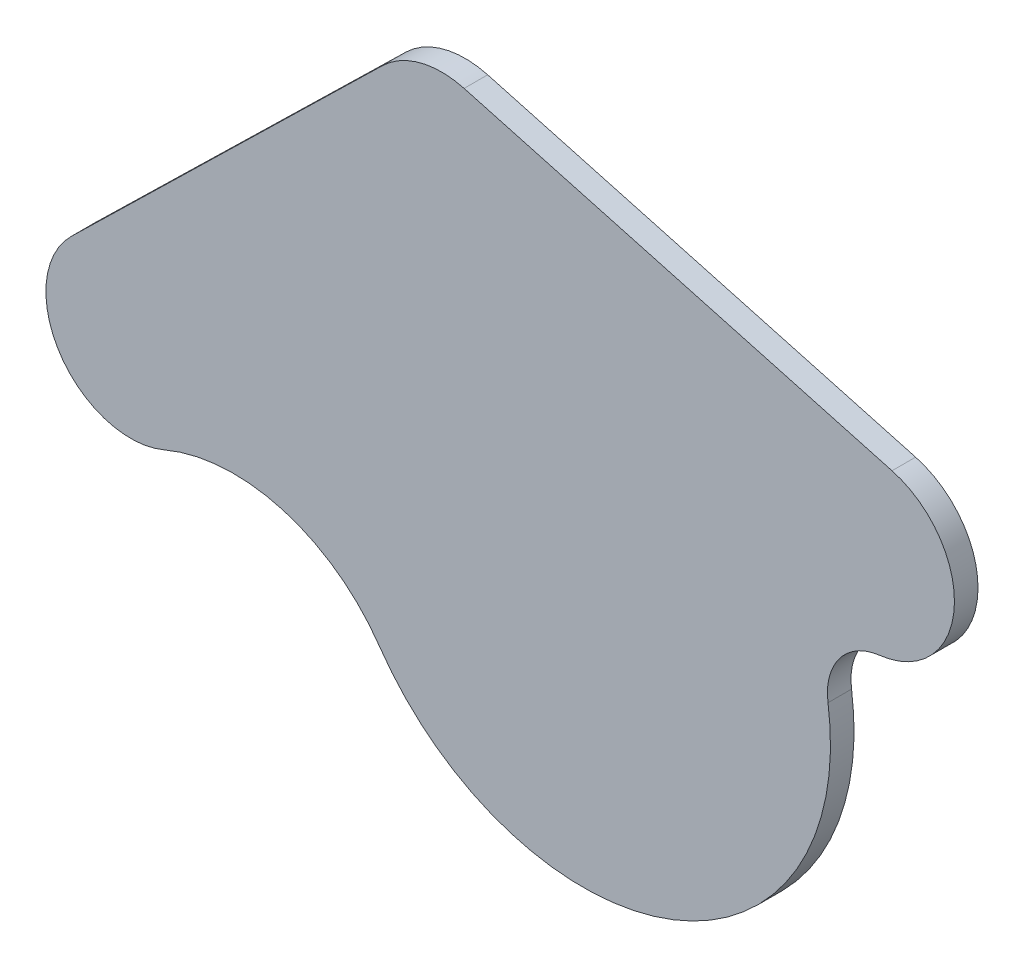
ISO-10303-21;
HEADER;
FILE_DESCRIPTION(('STEP AP214'),'2;1');
FILE_NAME('part.step','',(''),(''),'','','');
FILE_SCHEMA(('AUTOMOTIVE_DESIGN { 1 0 10303 214 1 1 1 1 }'));
ENDSEC;
DATA;
#1=APPLICATION_CONTEXT('core data for automotive mechanical design processes');
#2=APPLICATION_PROTOCOL_DEFINITION('international standard','automotive_design',2000,#1);
#3=PRODUCT_CONTEXT('',#1,'mechanical');
#4=PRODUCT('Part','Part','',(#3));
#5=PRODUCT_RELATED_PRODUCT_CATEGORY('part','',(#4));
#6=PRODUCT_DEFINITION_FORMATION('','',#4);
#7=PRODUCT_DEFINITION_CONTEXT('part definition',#1,'design');
#8=PRODUCT_DEFINITION('design','',#6,#7);
#9=PRODUCT_DEFINITION_SHAPE('','',#8);
#10=(LENGTH_UNIT() NAMED_UNIT(*) SI_UNIT(.MILLI.,.METRE.));
#11=(NAMED_UNIT(*) PLANE_ANGLE_UNIT() SI_UNIT($,.RADIAN.));
#12=(NAMED_UNIT(*) SI_UNIT($,.STERADIAN.) SOLID_ANGLE_UNIT());
#13=UNCERTAINTY_MEASURE_WITH_UNIT(LENGTH_MEASURE(1.E-05),#10,'distance_accuracy_value','');
#14=(GEOMETRIC_REPRESENTATION_CONTEXT(3) GLOBAL_UNCERTAINTY_ASSIGNED_CONTEXT((#13)) GLOBAL_UNIT_ASSIGNED_CONTEXT((#10,
#11,#12)) REPRESENTATION_CONTEXT('',''));
#15=CARTESIAN_POINT('',(0.,0.,0.));
#16=DIRECTION('',(0.,0.,1.));
#17=DIRECTION('',(1.,0.,0.));
#18=AXIS2_PLACEMENT_3D('',#15,#16,#17);
#19=CARTESIAN_POINT('',(32.6881010848531,4.66995154861667,2.54));
#20=DIRECTION('',(0.,0.,-1.));
#21=DIRECTION('',(-1.,0.,0.));
#22=AXIS2_PLACEMENT_3D('',#19,#20,#21);
#23=CYLINDRICAL_SURFACE('',#22,6.35);
#24=CARTESIAN_POINT('',(32.6881010848531,4.66995154861667,0.));
#25=DIRECTION('',(0.,0.,-1.));
#26=DIRECTION('',(1.,0.,0.));
#27=AXIS2_PLACEMENT_3D('',#24,#25,#26);
#28=CIRCLE('',#27,6.35);
#29=CARTESIAN_POINT('',(26.4019277993044,3.77188394311348,0.));
#30=VERTEX_POINT('',#29);
#31=CARTESIAN_POINT('',(31.9504518768927,10.9769614301687,0.));
#32=VERTEX_POINT('',#31);
#33=EDGE_CURVE('E135',#30,#32,#28,.T.);
#34=ORIENTED_EDGE('',*,*,#33,.T.);
#35=DIRECTION('',(0.,0.,-1.));
#36=VECTOR('',#35,1.);
#37=CARTESIAN_POINT('',(31.9504518768927,10.9769614301687,2.54));
#38=LINE('',#37,#36);
#39=CARTESIAN_POINT('',(31.9504518768927,10.9769614301687,2.54));
#40=VERTEX_POINT('',#39);
#41=EDGE_CURVE('E11',#40,#32,#38,.T.);
#42=ORIENTED_EDGE('',*,*,#41,.F.);
#43=CARTESIAN_POINT('',(32.6881010848531,4.66995154861667,2.54));
#44=DIRECTION('',(0.,0.,-1.));
#45=DIRECTION('',(1.,0.,0.));
#46=AXIS2_PLACEMENT_3D('',#43,#44,#45);
#47=CIRCLE('',#46,6.35);
#48=CARTESIAN_POINT('',(26.4019277993044,3.77188394311348,2.54));
#49=VERTEX_POINT('',#48);
#50=EDGE_CURVE('E149',#49,#40,#47,.T.);
#51=ORIENTED_EDGE('',*,*,#50,.F.);
#52=DIRECTION('',(0.,0.,-1.));
#53=VECTOR('',#52,1.);
#54=CARTESIAN_POINT('',(26.4019277993044,3.77188394311348,2.54));
#55=LINE('',#54,#53);
#56=EDGE_CURVE('E131',#49,#30,#55,.T.);
#57=ORIENTED_EDGE('',*,*,#56,.T.);
#58=EDGE_LOOP('',(#34,#42,#51,#57));
#59=FACE_BOUND('',#58,.T.);
#60=ADVANCED_FACE('F39',(#59),#23,.F.);
#61=CARTESIAN_POINT('',(30.8882370174298,20.0590556596037,2.54));
#62=DIRECTION('',(0.,0.,-1.));
#63=DIRECTION('',(-1.,0.,0.));
#64=AXIS2_PLACEMENT_3D('',#61,#62,#63);
#65=CYLINDRICAL_SURFACE('',#64,9.14400000000001);
#66=CARTESIAN_POINT('',(30.8882370174298,20.0590556596037,0.));
#67=DIRECTION('',(0.,0.,1.));
#68=DIRECTION('',(1.,0.,0.));
#69=AXIS2_PLACEMENT_3D('',#66,#67,#68);
#70=CIRCLE('',#69,9.14400000000001);
#71=CARTESIAN_POINT('',(33.3027955083197,28.8785025410171,0.));
#72=VERTEX_POINT('',#71);
#73=EDGE_CURVE('E138',#32,#72,#70,.T.);
#74=ORIENTED_EDGE('',*,*,#73,.T.);
#75=DIRECTION('',(0.,0.,-1.));
#76=VECTOR('',#75,1.);
#77=CARTESIAN_POINT('',(33.3027955083197,28.8785025410171,2.54));
#78=LINE('',#77,#76);
#79=CARTESIAN_POINT('',(33.3027955083197,28.8785025410171,2.54));
#80=VERTEX_POINT('',#79);
#81=EDGE_CURVE('E47',#80,#72,#78,.T.);
#82=ORIENTED_EDGE('',*,*,#81,.F.);
#83=CARTESIAN_POINT('',(30.8882370174298,20.0590556596037,2.54));
#84=DIRECTION('',(0.,0.,1.));
#85=DIRECTION('',(1.,0.,0.));
#86=AXIS2_PLACEMENT_3D('',#83,#84,#85);
#87=CIRCLE('',#86,9.14400000000001);
#88=EDGE_CURVE('E98',#40,#80,#87,.T.);
#89=ORIENTED_EDGE('',*,*,#88,.F.);
#90=ORIENTED_EDGE('',*,*,#41,.T.);
#91=EDGE_LOOP('',(#74,#82,#89,#90));
#92=FACE_BOUND('',#91,.T.);
#93=ADVANCED_FACE('F184',(#92),#65,.T.);
#94=CARTESIAN_POINT('',(-12.8284369735738,41.5081561442511,2.54));
#95=DIRECTION('',(-0.264059327525146,-0.964506439349664,0.));
#96=DIRECTION('',(0.964506439349665,-0.264059327525146,0.));
#97=AXIS2_PLACEMENT_3D('',#94,#95,#96);
#98=PLANE('',#97);
#99=DIRECTION('',(-0.964506439349664,0.264059327525146,0.));
#100=VECTOR('',#99,1.);
#101=CARTESIAN_POINT('',(-12.8284369735738,41.5081561442511,0.));
#102=LINE('',#101,#100);
#103=CARTESIAN_POINT('',(-12.8284369735738,41.5081561442511,0.));
#104=VERTEX_POINT('',#103);
#105=EDGE_CURVE('E140',#72,#104,#102,.T.);
#106=ORIENTED_EDGE('',*,*,#105,.T.);
#107=DIRECTION('',(0.,0.,-1.));
#108=VECTOR('',#107,1.);
#109=CARTESIAN_POINT('',(-12.8284369735738,41.5081561442511,2.54));
#110=LINE('',#109,#108);
#111=CARTESIAN_POINT('',(-12.8284369735738,41.5081561442511,2.54));
#112=VERTEX_POINT('',#111);
#113=EDGE_CURVE('E156',#112,#104,#110,.T.);
#114=ORIENTED_EDGE('',*,*,#113,.F.);
#115=DIRECTION('',(-0.964506439349664,0.264059327525146,0.));
#116=VECTOR('',#115,1.);
#117=CARTESIAN_POINT('',(-12.8284369735738,41.5081561442511,2.54));
#118=LINE('',#117,#116);
#119=EDGE_CURVE('E164',#80,#112,#118,.T.);
#120=ORIENTED_EDGE('',*,*,#119,.F.);
#121=ORIENTED_EDGE('',*,*,#81,.T.);
#122=EDGE_LOOP('',(#106,#114,#120,#121));
#123=FACE_BOUND('',#122,.T.);
#124=ADVANCED_FACE('F162',(#123),#98,.F.);
#125=CARTESIAN_POINT('',(-15.2429954644637,32.6887092628378,2.54));
#126=DIRECTION('',(0.,0.,-1.));
#127=DIRECTION('',(-1.,0.,0.));
#128=AXIS2_PLACEMENT_3D('',#125,#126,#127);
#129=CYLINDRICAL_SURFACE('',#128,9.144);
#130=CARTESIAN_POINT('',(-15.2429954644637,32.6887092628378,0.));
#131=DIRECTION('',(0.,0.,1.));
#132=DIRECTION('',(1.,0.,0.));
#133=AXIS2_PLACEMENT_3D('',#130,#131,#132);
#134=CIRCLE('',#133,9.144);
#135=CARTESIAN_POINT('',(-21.6266062994173,39.2356359240937,0.));
#136=VERTEX_POINT('',#135);
#137=EDGE_CURVE('E142',#104,#136,#134,.T.);
#138=ORIENTED_EDGE('',*,*,#137,.T.);
#139=DIRECTION('',(0.,0.,-1.));
#140=VECTOR('',#139,1.);
#141=CARTESIAN_POINT('',(-21.6266062994173,39.2356359240937,2.54));
#142=LINE('',#141,#140);
#143=CARTESIAN_POINT('',(-21.6266062994173,39.2356359240937,2.54));
#144=VERTEX_POINT('',#143);
#145=EDGE_CURVE('E153',#144,#136,#142,.T.);
#146=ORIENTED_EDGE('',*,*,#145,.F.);
#147=CARTESIAN_POINT('',(-15.2429954644637,32.6887092628378,2.54));
#148=DIRECTION('',(0.,0.,1.));
#149=DIRECTION('',(1.,0.,0.));
#150=AXIS2_PLACEMENT_3D('',#147,#148,#149);
#151=CIRCLE('',#150,9.144);
#152=EDGE_CURVE('E176',#112,#144,#151,.T.);
#153=ORIENTED_EDGE('',*,*,#152,.F.);
#154=ORIENTED_EDGE('',*,*,#113,.T.);
#155=EDGE_LOOP('',(#138,#146,#153,#154));
#156=FACE_BOUND('',#155,.T.);
#157=ADVANCED_FACE('F172',(#156),#129,.T.);
#158=CARTESIAN_POINT('',(-21.6266062994173,39.2356359240937,2.54));
#159=DIRECTION('',(0.698120170051788,-0.715980605999117,0.));
#160=DIRECTION('',(0.715980605999117,0.698120170051788,0.));
#161=AXIS2_PLACEMENT_3D('',#158,#159,#160);
#162=PLANE('',#161);
#163=DIRECTION('',(-0.715980605999117,-0.698120170051788,0.));
#164=VECTOR('',#163,1.);
#165=CARTESIAN_POINT('',(-21.6266062994173,39.2356359240937,0.));
#166=LINE('',#165,#164);
#167=CARTESIAN_POINT('',(-55.1516108349535,6.54692666125592,0.));
#168=VERTEX_POINT('',#167);
#169=EDGE_CURVE('E144',#136,#168,#166,.T.);
#170=ORIENTED_EDGE('',*,*,#169,.T.);
#171=DIRECTION('',(0.,0.,-1.));
#172=VECTOR('',#171,1.);
#173=CARTESIAN_POINT('',(-55.1516108349535,6.54692666125592,2.54));
#174=LINE('',#173,#172);
#175=CARTESIAN_POINT('',(-55.1516108349535,6.54692666125592,2.54));
#176=VERTEX_POINT('',#175);
#177=EDGE_CURVE('E126',#176,#168,#174,.T.);
#178=ORIENTED_EDGE('',*,*,#177,.F.);
#179=DIRECTION('',(-0.715980605999117,-0.698120170051788,0.));
#180=VECTOR('',#179,1.);
#181=CARTESIAN_POINT('',(-21.6266062994173,39.2356359240937,2.54));
#182=LINE('',#181,#180);
#183=EDGE_CURVE('E117',#144,#176,#182,.T.);
#184=ORIENTED_EDGE('',*,*,#183,.F.);
#185=ORIENTED_EDGE('',*,*,#145,.T.);
#186=EDGE_LOOP('',(#170,#178,#184,#185));
#187=FACE_BOUND('',#186,.T.);
#188=ADVANCED_FACE('F175',(#187),#162,.F.);
#189=CARTESIAN_POINT('',(-48.768,0.,2.54));
#190=DIRECTION('',(0.,0.,-1.));
#191=DIRECTION('',(-1.,0.,0.));
#192=AXIS2_PLACEMENT_3D('',#189,#190,#191);
#193=CYLINDRICAL_SURFACE('',#192,9.144);
#194=CARTESIAN_POINT('',(-48.768,0.,0.));
#195=DIRECTION('',(0.,0.,1.));
#196=DIRECTION('',(1.,0.,0.));
#197=AXIS2_PLACEMENT_3D('',#194,#195,#196);
#198=CIRCLE('',#197,9.144);
#199=CARTESIAN_POINT('',(-45.1671638513513,-8.40516002409146,0.));
#200=VERTEX_POINT('',#199);
#201=EDGE_CURVE('E125',#168,#200,#198,.T.);
#202=ORIENTED_EDGE('',*,*,#201,.T.);
#203=DIRECTION('',(0.,0.,-1.));
#204=VECTOR('',#203,1.);
#205=CARTESIAN_POINT('',(-45.1671638513513,-8.40516002409146,2.54));
#206=LINE('',#205,#204);
#207=CARTESIAN_POINT('',(-45.1671638513513,-8.40516002409146,2.54));
#208=VERTEX_POINT('',#207);
#209=EDGE_CURVE('E122',#208,#200,#206,.T.);
#210=ORIENTED_EDGE('',*,*,#209,.F.);
#211=CARTESIAN_POINT('',(-48.768,0.,2.54));
#212=DIRECTION('',(0.,0.,1.));
#213=DIRECTION('',(1.,0.,0.));
#214=AXIS2_PLACEMENT_3D('',#211,#212,#213);
#215=CIRCLE('',#214,9.144);
#216=EDGE_CURVE('E111',#176,#208,#215,.T.);
#217=ORIENTED_EDGE('',*,*,#216,.F.);
#218=ORIENTED_EDGE('',*,*,#177,.T.);
#219=EDGE_LOOP('',(#202,#210,#217,#218));
#220=FACE_BOUND('',#219,.T.);
#221=ADVANCED_FACE('F123',(#220),#193,.T.);
#222=CARTESIAN_POINT('',(-37.665421875,-25.915910074282,2.54));
#223=DIRECTION('',(0.,0.,-1.));
#224=DIRECTION('',(-1.,0.,0.));
#225=AXIS2_PLACEMENT_3D('',#222,#223,#224);
#226=CYLINDRICAL_SURFACE('',#225,19.05);
#227=CARTESIAN_POINT('',(-37.665421875,-25.915910074282,0.));
#228=DIRECTION('',(0.,0.,-1.));
#229=DIRECTION('',(1.,0.,0.));
#230=AXIS2_PLACEMENT_3D('',#227,#228,#229);
#231=CIRCLE('',#230,19.05);
#232=CARTESIAN_POINT('',(-21.97149609375,-15.1176142099978,0.));
#233=VERTEX_POINT('',#232);
#234=EDGE_CURVE('E84',#200,#233,#231,.T.);
#235=ORIENTED_EDGE('',*,*,#234,.T.);
#236=DIRECTION('',(0.,0.,-1.));
#237=VECTOR('',#236,1.);
#238=CARTESIAN_POINT('',(-21.97149609375,-15.1176142099978,2.54));
#239=LINE('',#238,#237);
#240=CARTESIAN_POINT('',(-21.97149609375,-15.1176142099978,2.54));
#241=VERTEX_POINT('',#240);
#242=EDGE_CURVE('E127',#241,#233,#239,.T.);
#243=ORIENTED_EDGE('',*,*,#242,.F.);
#244=CARTESIAN_POINT('',(-37.665421875,-25.915910074282,2.54));
#245=DIRECTION('',(0.,0.,-1.));
#246=DIRECTION('',(1.,0.,0.));
#247=AXIS2_PLACEMENT_3D('',#244,#245,#246);
#248=CIRCLE('',#247,19.05);
#249=EDGE_CURVE('E115',#208,#241,#248,.T.);
#250=ORIENTED_EDGE('',*,*,#249,.F.);
#251=ORIENTED_EDGE('',*,*,#209,.T.);
#252=EDGE_LOOP('',(#235,#243,#250,#251));
#253=FACE_BOUND('',#252,.T.);
#254=ADVANCED_FACE('F129',(#253),#226,.F.);
#255=CARTESIAN_POINT('',(0.,0.,2.54));
#256=DIRECTION('',(0.,0.,-1.));
#257=DIRECTION('',(-1.,0.,0.));
#258=AXIS2_PLACEMENT_3D('',#255,#256,#257);
#259=CYLINDRICAL_SURFACE('',#258,26.67);
#260=CARTESIAN_POINT('',(0.,0.,0.));
#261=DIRECTION('',(0.,0.,1.));
#262=DIRECTION('',(1.,0.,0.));
#263=AXIS2_PLACEMENT_3D('',#260,#261,#262);
#264=CIRCLE('',#263,26.67);
#265=EDGE_CURVE('E90',#233,#30,#264,.T.);
#266=ORIENTED_EDGE('',*,*,#265,.T.);
#267=ORIENTED_EDGE('',*,*,#56,.F.);
#268=CARTESIAN_POINT('',(0.,0.,2.54));
#269=DIRECTION('',(0.,0.,1.));
#270=DIRECTION('',(1.,0.,0.));
#271=AXIS2_PLACEMENT_3D('',#268,#269,#270);
#272=CIRCLE('',#271,26.67);
#273=EDGE_CURVE('E55',#241,#49,#272,.T.);
#274=ORIENTED_EDGE('',*,*,#273,.F.);
#275=ORIENTED_EDGE('',*,*,#242,.T.);
#276=EDGE_LOOP('',(#266,#267,#274,#275));
#277=FACE_BOUND('',#276,.T.);
#278=ADVANCED_FACE('F200',(#277),#259,.T.);
#279=CARTESIAN_POINT('',(32.6881010848531,4.66995154861667,2.54));
#280=DIRECTION('',(0.,0.,1.));
#281=DIRECTION('',(1.,0.,0.));
#282=AXIS2_PLACEMENT_3D('',#279,#280,#281);
#283=PLANE('',#282);
#284=ORIENTED_EDGE('',*,*,#50,.T.);
#285=ORIENTED_EDGE('',*,*,#88,.T.);
#286=ORIENTED_EDGE('',*,*,#119,.T.);
#287=ORIENTED_EDGE('',*,*,#152,.T.);
#288=ORIENTED_EDGE('',*,*,#183,.T.);
#289=ORIENTED_EDGE('',*,*,#216,.T.);
#290=ORIENTED_EDGE('',*,*,#249,.T.);
#291=ORIENTED_EDGE('',*,*,#273,.T.);
#292=EDGE_LOOP('',(#284,#285,#286,#287,#288,#289,#290,#291));
#293=FACE_BOUND('',#292,.T.);
#294=ADVANCED_FACE('F113',(#293),#283,.T.);
#295=CARTESIAN_POINT('',(32.6881010848531,4.66995154861667,0.));
#296=DIRECTION('',(0.,0.,1.));
#297=DIRECTION('',(1.,0.,0.));
#298=AXIS2_PLACEMENT_3D('',#295,#296,#297);
#299=PLANE('',#298);
#300=ORIENTED_EDGE('',*,*,#33,.F.);
#301=ORIENTED_EDGE('',*,*,#265,.F.);
#302=ORIENTED_EDGE('',*,*,#234,.F.);
#303=ORIENTED_EDGE('',*,*,#201,.F.);
#304=ORIENTED_EDGE('',*,*,#169,.F.);
#305=ORIENTED_EDGE('',*,*,#137,.F.);
#306=ORIENTED_EDGE('',*,*,#105,.F.);
#307=ORIENTED_EDGE('',*,*,#73,.F.);
#308=EDGE_LOOP('',(#300,#301,#302,#303,#304,#305,#306,#307));
#309=FACE_BOUND('',#308,.T.);
#310=ADVANCED_FACE('F168',(#309),#299,.F.);
#311=CLOSED_SHELL('',(#60,#93,#124,#157,#188,#221,#254,#278,#294,#310));
#312=MANIFOLD_SOLID_BREP('B2',#311);
#313=ADVANCED_BREP_SHAPE_REPRESENTATION('',(#18,#312),#14);
#314=SHAPE_DEFINITION_REPRESENTATION(#9,#313);
ENDSEC;
END-ISO-10303-21;
